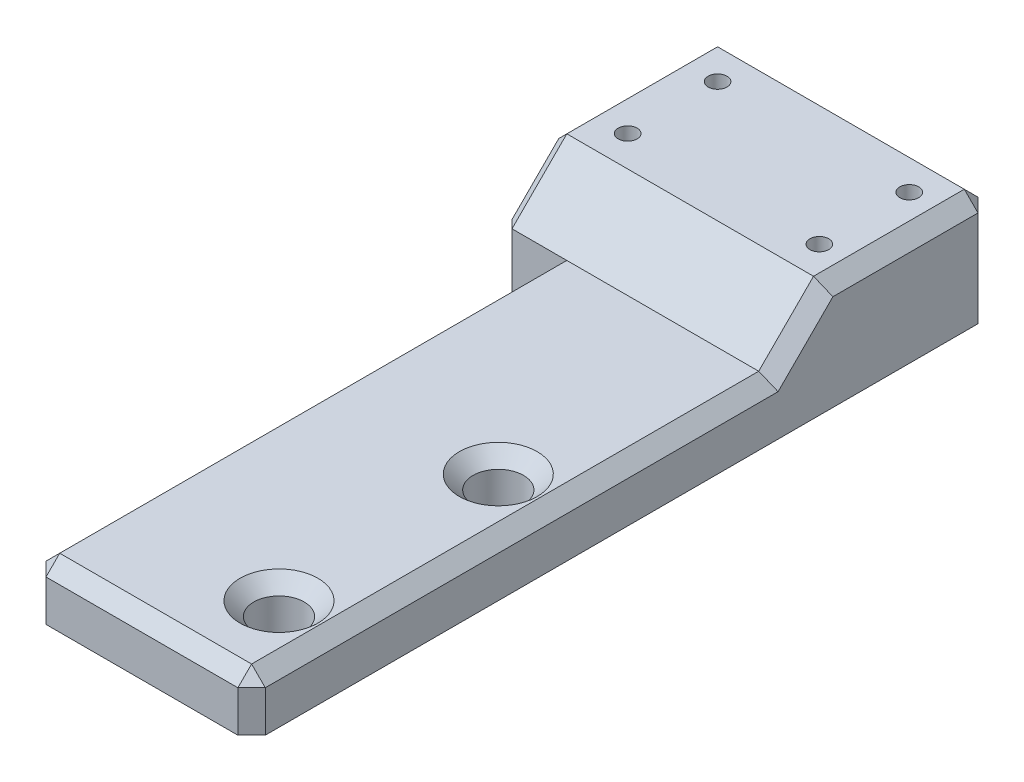
ISO-10303-21;
HEADER;
FILE_DESCRIPTION(('STEP AP214'),'2;1');
FILE_NAME('part.step','',(''),(''),'','','');
FILE_SCHEMA(('AUTOMOTIVE_DESIGN { 1 0 10303 214 1 1 1 1 }'));
ENDSEC;
DATA;
#1=APPLICATION_CONTEXT('core data for automotive mechanical design processes');
#2=APPLICATION_PROTOCOL_DEFINITION('international standard','automotive_design',2000,#1);
#3=PRODUCT_CONTEXT('',#1,'mechanical');
#4=PRODUCT('Part','Part','',(#3));
#5=PRODUCT_RELATED_PRODUCT_CATEGORY('part','',(#4));
#6=PRODUCT_DEFINITION_FORMATION('','',#4);
#7=PRODUCT_DEFINITION_CONTEXT('part definition',#1,'design');
#8=PRODUCT_DEFINITION('design','',#6,#7);
#9=PRODUCT_DEFINITION_SHAPE('','',#8);
#10=(LENGTH_UNIT() NAMED_UNIT(*) SI_UNIT(.MILLI.,.METRE.));
#11=(NAMED_UNIT(*) PLANE_ANGLE_UNIT() SI_UNIT($,.RADIAN.));
#12=(NAMED_UNIT(*) SI_UNIT($,.STERADIAN.) SOLID_ANGLE_UNIT());
#13=UNCERTAINTY_MEASURE_WITH_UNIT(LENGTH_MEASURE(1.E-05),#10,'distance_accuracy_value','');
#14=(GEOMETRIC_REPRESENTATION_CONTEXT(3) GLOBAL_UNCERTAINTY_ASSIGNED_CONTEXT((#13)) GLOBAL_UNIT_ASSIGNED_CONTEXT((#10,
#11,#12)) REPRESENTATION_CONTEXT('',''));
#15=CARTESIAN_POINT('',(0.,0.,0.));
#16=DIRECTION('',(0.,0.,1.));
#17=DIRECTION('',(1.,0.,0.));
#18=AXIS2_PLACEMENT_3D('',#15,#16,#17);
#19=CARTESIAN_POINT('',(0.,12.7,0.));
#20=DIRECTION('',(0.,-1.,0.));
#21=DIRECTION('',(0.,0.,-1.));
#22=AXIS2_PLACEMENT_3D('',#19,#20,#21);
#23=PLANE('',#22);
#24=CARTESIAN_POINT('',(5.08,12.7,-80.645));
#25=DIRECTION('',(0.,-1.,0.));
#26=DIRECTION('',(0.,0.,-1.));
#27=AXIS2_PLACEMENT_3D('',#24,#25,#26);
#28=CIRCLE('',#27,1.09219999999999);
#29=CARTESIAN_POINT('',(5.08,12.7,-81.7372));
#30=VERTEX_POINT('',#29);
#31=EDGE_CURVE('E203',#30,#30,#28,.T.);
#32=ORIENTED_EDGE('',*,*,#31,.T.);
#33=EDGE_LOOP('',(#32));
#34=FACE_BOUND('',#33,.T.);
#35=CARTESIAN_POINT('',(27.2796,12.7,-80.645));
#36=DIRECTION('',(0.,-1.,0.));
#37=DIRECTION('',(0.,0.,-1.));
#38=AXIS2_PLACEMENT_3D('',#35,#36,#37);
#39=CIRCLE('',#38,1.0922);
#40=CARTESIAN_POINT('',(27.2796,12.7,-81.7372));
#41=VERTEX_POINT('',#40);
#42=EDGE_CURVE('E182',#41,#41,#39,.T.);
#43=ORIENTED_EDGE('',*,*,#42,.T.);
#44=EDGE_LOOP('',(#43));
#45=FACE_BOUND('',#44,.T.);
#46=CARTESIAN_POINT('',(5.08,12.7,-70.231));
#47=DIRECTION('',(0.,-1.,0.));
#48=DIRECTION('',(0.,0.,-1.));
#49=AXIS2_PLACEMENT_3D('',#46,#47,#48);
#50=CIRCLE('',#49,1.09219999999999);
#51=CARTESIAN_POINT('',(5.08,12.7,-71.3232));
#52=VERTEX_POINT('',#51);
#53=EDGE_CURVE('E409',#52,#52,#50,.T.);
#54=ORIENTED_EDGE('',*,*,#53,.T.);
#55=EDGE_LOOP('',(#54));
#56=FACE_BOUND('',#55,.T.);
#57=CARTESIAN_POINT('',(27.2796,12.7,-70.231));
#58=DIRECTION('',(0.,-1.,0.));
#59=DIRECTION('',(0.,0.,-1.));
#60=AXIS2_PLACEMENT_3D('',#57,#58,#59);
#61=CIRCLE('',#60,1.0922);
#62=CARTESIAN_POINT('',(27.2796,12.7,-71.3232));
#63=VERTEX_POINT('',#62);
#64=EDGE_CURVE('E194',#63,#63,#61,.T.);
#65=ORIENTED_EDGE('',*,*,#64,.T.);
#66=EDGE_LOOP('',(#65));
#67=FACE_BOUND('',#66,.T.);
#68=DIRECTION('',(1.,0.,0.));
#69=VECTOR('',#68,1.);
#70=CARTESIAN_POINT('',(0.,12.7,-66.675));
#71=LINE('',#70,#69);
#72=CARTESIAN_POINT('',(1.58750000000002,12.7,-66.675));
#73=VERTEX_POINT('',#72);
#74=CARTESIAN_POINT('',(30.1625,12.7,-66.675));
#75=VERTEX_POINT('',#74);
#76=EDGE_CURVE('E230',#73,#75,#71,.T.);
#77=ORIENTED_EDGE('',*,*,#76,.T.);
#78=DIRECTION('',(0.,0.,-1.));
#79=VECTOR('',#78,1.);
#80=CARTESIAN_POINT('',(30.1625,12.7,0.));
#81=LINE('',#80,#79);
#82=CARTESIAN_POINT('',(30.1625,12.7,-84.1375));
#83=VERTEX_POINT('',#82);
#84=EDGE_CURVE('E326',#75,#83,#81,.T.);
#85=ORIENTED_EDGE('',*,*,#84,.T.);
#86=DIRECTION('',(-1.,0.,0.));
#87=VECTOR('',#86,1.);
#88=CARTESIAN_POINT('',(0.,12.7,-84.1375));
#89=LINE('',#88,#87);
#90=CARTESIAN_POINT('',(1.58750000000002,12.7,-84.1375));
#91=VERTEX_POINT('',#90);
#92=EDGE_CURVE('E323',#83,#91,#89,.T.);
#93=ORIENTED_EDGE('',*,*,#92,.T.);
#94=DIRECTION('',(0.,0.,1.));
#95=VECTOR('',#94,1.);
#96=CARTESIAN_POINT('',(1.58750000000002,12.7,0.));
#97=LINE('',#96,#95);
#98=EDGE_CURVE('E320',#91,#73,#97,.T.);
#99=ORIENTED_EDGE('',*,*,#98,.T.);
#100=EDGE_LOOP('',(#77,#85,#93,#99));
#101=FACE_BOUND('',#100,.T.);
#102=ADVANCED_FACE('F41',(#34,#45,#56,#67,#101),#23,.F.);
#103=CARTESIAN_POINT('',(0.,0.,0.));
#104=DIRECTION('',(0.,-1.,0.));
#105=DIRECTION('',(0.,0.,-1.));
#106=AXIS2_PLACEMENT_3D('',#103,#104,#105);
#107=PLANE('',#106);
#108=CARTESIAN_POINT('',(5.08,0.,-80.645));
#109=DIRECTION('',(0.,-1.,0.));
#110=DIRECTION('',(0.,0.,-1.));
#111=AXIS2_PLACEMENT_3D('',#108,#109,#110);
#112=CIRCLE('',#111,1.09219999999999);
#113=CARTESIAN_POINT('',(5.08,0.,-81.7372));
#114=VERTEX_POINT('',#113);
#115=EDGE_CURVE('E173',#114,#114,#112,.T.);
#116=ORIENTED_EDGE('',*,*,#115,.F.);
#117=EDGE_LOOP('',(#116));
#118=FACE_BOUND('',#117,.T.);
#119=DIRECTION('',(-1.,0.,0.));
#120=VECTOR('',#119,1.);
#121=CARTESIAN_POINT('',(0.,0.,-85.725));
#122=LINE('',#121,#120);
#123=CARTESIAN_POINT('',(30.1625,0.,-85.725));
#124=VERTEX_POINT('',#123);
#125=CARTESIAN_POINT('',(1.58750000000002,0.,-85.725));
#126=VERTEX_POINT('',#125);
#127=EDGE_CURVE('E226',#124,#126,#122,.T.);
#128=ORIENTED_EDGE('',*,*,#127,.F.);
#129=DIRECTION('',(-0.707106781186544,0.,-0.707106781186551));
#130=VECTOR('',#129,1.);
#131=CARTESIAN_POINT('',(57.9437500000001,0.,-57.9437499999996));
#132=LINE('',#131,#130);
#133=CARTESIAN_POINT('',(31.75,0.,-84.1375));
#134=VERTEX_POINT('',#133);
#135=EDGE_CURVE('E282',#124,#134,#132,.F.);
#136=ORIENTED_EDGE('',*,*,#135,.T.);
#137=DIRECTION('',(0.,0.,-1.));
#138=VECTOR('',#137,1.);
#139=CARTESIAN_POINT('',(31.75,0.,0.));
#140=LINE('',#139,#138);
#141=CARTESIAN_POINT('',(31.75,0.,-1.58750000000001));
#142=VERTEX_POINT('',#141);
#143=EDGE_CURVE('E222',#142,#134,#140,.T.);
#144=ORIENTED_EDGE('',*,*,#143,.F.);
#145=DIRECTION('',(0.707106781186551,0.,-0.707106781186544));
#146=VECTOR('',#145,1.);
#147=CARTESIAN_POINT('',(15.0812499999999,0.,15.08125));
#148=LINE('',#147,#146);
#149=CARTESIAN_POINT('',(30.1625,0.,0.));
#150=VERTEX_POINT('',#149);
#151=EDGE_CURVE('E279',#142,#150,#148,.F.);
#152=ORIENTED_EDGE('',*,*,#151,.T.);
#153=DIRECTION('',(1.,0.,0.));
#154=VECTOR('',#153,1.);
#155=CARTESIAN_POINT('',(0.,0.,0.));
#156=LINE('',#155,#154);
#157=CARTESIAN_POINT('',(7.93750000000001,0.,0.));
#158=VERTEX_POINT('',#157);
#159=EDGE_CURVE('E218',#158,#150,#156,.T.);
#160=ORIENTED_EDGE('',*,*,#159,.F.);
#161=DIRECTION('',(0.707106781186544,0.,0.707106781186551));
#162=VECTOR('',#161,1.);
#163=CARTESIAN_POINT('',(3.96875000000004,0.,-3.96875));
#164=LINE('',#163,#162);
#165=CARTESIAN_POINT('',(6.35,0.,-1.58750000000002));
#166=VERTEX_POINT('',#165);
#167=EDGE_CURVE('E189',#158,#166,#164,.F.);
#168=ORIENTED_EDGE('',*,*,#167,.T.);
#169=DIRECTION('',(0.,0.,1.));
#170=VECTOR('',#169,1.);
#171=CARTESIAN_POINT('',(6.35,0.,0.));
#172=LINE('',#171,#170);
#173=CARTESIAN_POINT('',(6.35000000000001,0.,-60.325));
#174=VERTEX_POINT('',#173);
#175=EDGE_CURVE('E166',#174,#166,#172,.T.);
#176=ORIENTED_EDGE('',*,*,#175,.F.);
#177=DIRECTION('',(1.,0.,0.));
#178=VECTOR('',#177,1.);
#179=CARTESIAN_POINT('',(0.,0.,-60.325));
#180=LINE('',#179,#178);
#181=CARTESIAN_POINT('',(1.58750000000002,0.,-60.325));
#182=VERTEX_POINT('',#181);
#183=EDGE_CURVE('E176',#182,#174,#180,.T.);
#184=ORIENTED_EDGE('',*,*,#183,.F.);
#185=DIRECTION('',(0.707106781186551,0.,0.707106781186544));
#186=VECTOR('',#185,1.);
#187=CARTESIAN_POINT('',(30.95625,0.,-30.9562500000003));
#188=LINE('',#187,#186);
#189=CARTESIAN_POINT('',(0.,0.,-61.9125));
#190=VERTEX_POINT('',#189);
#191=EDGE_CURVE('E271',#182,#190,#188,.F.);
#192=ORIENTED_EDGE('',*,*,#191,.T.);
#193=DIRECTION('',(0.,0.,1.));
#194=VECTOR('',#193,1.);
#195=CARTESIAN_POINT('',(0.,0.,0.));
#196=LINE('',#195,#194);
#197=CARTESIAN_POINT('',(0.,0.,-84.1375));
#198=VERTEX_POINT('',#197);
#199=EDGE_CURVE('E214',#198,#190,#196,.T.);
#200=ORIENTED_EDGE('',*,*,#199,.F.);
#201=DIRECTION('',(-0.707106781186551,0.,0.707106781186544));
#202=VECTOR('',#201,1.);
#203=CARTESIAN_POINT('',(-42.06875,0.,-42.0687500000004));
#204=LINE('',#203,#202);
#205=EDGE_CURVE('E274',#198,#126,#204,.F.);
#206=ORIENTED_EDGE('',*,*,#205,.T.);
#207=EDGE_LOOP('',(#128,#136,#144,#152,#160,#168,#176,#184,#192,#200,#206));
#208=FACE_BOUND('',#207,.T.);
#209=CARTESIAN_POINT('',(27.2796,0.,-80.645));
#210=DIRECTION('',(0.,-1.,0.));
#211=DIRECTION('',(0.,0.,-1.));
#212=AXIS2_PLACEMENT_3D('',#209,#210,#211);
#213=CIRCLE('',#212,1.0922);
#214=CARTESIAN_POINT('',(27.2796,0.,-81.7372));
#215=VERTEX_POINT('',#214);
#216=EDGE_CURVE('E415',#215,#215,#213,.T.);
#217=ORIENTED_EDGE('',*,*,#216,.F.);
#218=EDGE_LOOP('',(#217));
#219=FACE_BOUND('',#218,.T.);
#220=CARTESIAN_POINT('',(5.08,0.,-70.231));
#221=DIRECTION('',(0.,-1.,0.));
#222=DIRECTION('',(0.,0.,-1.));
#223=AXIS2_PLACEMENT_3D('',#220,#221,#222);
#224=CIRCLE('',#223,1.09219999999999);
#225=CARTESIAN_POINT('',(5.08,0.,-71.3232));
#226=VERTEX_POINT('',#225);
#227=EDGE_CURVE('E405',#226,#226,#224,.T.);
#228=ORIENTED_EDGE('',*,*,#227,.F.);
#229=EDGE_LOOP('',(#228));
#230=FACE_BOUND('',#229,.T.);
#231=CARTESIAN_POINT('',(27.2796,0.,-70.231));
#232=DIRECTION('',(0.,-1.,0.));
#233=DIRECTION('',(0.,0.,-1.));
#234=AXIS2_PLACEMENT_3D('',#231,#232,#233);
#235=CIRCLE('',#234,1.0922);
#236=CARTESIAN_POINT('',(27.2796,0.,-71.3232));
#237=VERTEX_POINT('',#236);
#238=EDGE_CURVE('E199',#237,#237,#235,.T.);
#239=ORIENTED_EDGE('',*,*,#238,.F.);
#240=EDGE_LOOP('',(#239));
#241=FACE_BOUND('',#240,.T.);
#242=CARTESIAN_POINT('',(25.4,0.,-9.525));
#243=DIRECTION('',(0.,1.,0.));
#244=DIRECTION('',(0.,0.,1.));
#245=AXIS2_PLACEMENT_3D('',#242,#243,#244);
#246=CIRCLE('',#245,2.921);
#247=CARTESIAN_POINT('',(25.4,0.,-6.604));
#248=VERTEX_POINT('',#247);
#249=EDGE_CURVE('E210',#248,#248,#246,.T.);
#250=ORIENTED_EDGE('',*,*,#249,.T.);
#251=EDGE_LOOP('',(#250));
#252=FACE_BOUND('',#251,.T.);
#253=CARTESIAN_POINT('',(25.4,0.,-34.925));
#254=DIRECTION('',(0.,1.,0.));
#255=DIRECTION('',(0.,0.,1.));
#256=AXIS2_PLACEMENT_3D('',#253,#254,#255);
#257=CIRCLE('',#256,2.921);
#258=CARTESIAN_POINT('',(25.4,0.,-32.004));
#259=VERTEX_POINT('',#258);
#260=EDGE_CURVE('E206',#259,#259,#257,.T.);
#261=ORIENTED_EDGE('',*,*,#260,.T.);
#262=EDGE_LOOP('',(#261));
#263=FACE_BOUND('',#262,.T.);
#264=ADVANCED_FACE('F185',(#118,#208,#219,#230,#241,#252,#263),#107,.T.);
#265=CARTESIAN_POINT('',(0.,12.7,0.));
#266=DIRECTION('',(1.,0.,0.));
#267=DIRECTION('',(0.,0.,-1.));
#268=AXIS2_PLACEMENT_3D('',#265,#266,#267);
#269=PLANE('',#268);
#270=DIRECTION('',(0.,0.,-1.));
#271=VECTOR('',#270,1.);
#272=CARTESIAN_POINT('',(0.,11.1125,0.));
#273=LINE('',#272,#271);
#274=CARTESIAN_POINT('',(0.,11.1125,-67.3325640302673));
#275=VERTEX_POINT('',#274);
#276=CARTESIAN_POINT('',(0.,11.1125,-84.1375));
#277=VERTEX_POINT('',#276);
#278=EDGE_CURVE('E68',#275,#277,#273,.T.);
#279=ORIENTED_EDGE('',*,*,#278,.T.);
#280=DIRECTION('',(0.,-1.,0.));
#281=VECTOR('',#280,1.);
#282=CARTESIAN_POINT('',(0.,12.7,-84.1375));
#283=LINE('',#282,#281);
#284=EDGE_CURVE('E337',#277,#198,#283,.T.);
#285=ORIENTED_EDGE('',*,*,#284,.T.);
#286=ORIENTED_EDGE('',*,*,#199,.T.);
#287=DIRECTION('',(0.,1.,0.));
#288=VECTOR('',#287,1.);
#289=CARTESIAN_POINT('',(0.,12.7,-61.9125));
#290=LINE('',#289,#288);
#291=CARTESIAN_POINT('',(0.,5.69243596973268,-61.9125));
#292=VERTEX_POINT('',#291);
#293=EDGE_CURVE('E329',#190,#292,#290,.T.);
#294=ORIENTED_EDGE('',*,*,#293,.T.);
#295=DIRECTION('',(0.,0.707106781186548,-0.707106781186547));
#296=VECTOR('',#295,1.);
#297=CARTESIAN_POINT('',(0.,11.5774679848664,-67.7975320151337));
#298=LINE('',#297,#296);
#299=EDGE_CURVE('E332',#292,#275,#298,.T.);
#300=ORIENTED_EDGE('',*,*,#299,.T.);
#301=EDGE_LOOP('',(#279,#285,#286,#294,#300));
#302=FACE_BOUND('',#301,.T.);
#303=ADVANCED_FACE('F428',(#302),#269,.F.);
#304=CARTESIAN_POINT('',(0.,12.7,0.));
#305=DIRECTION('',(0.,0.,-1.));
#306=DIRECTION('',(-1.,0.,0.));
#307=AXIS2_PLACEMENT_3D('',#304,#305,#306);
#308=PLANE('',#307);
#309=ORIENTED_EDGE('',*,*,#159,.T.);
#310=DIRECTION('',(0.,1.,0.));
#311=VECTOR('',#310,1.);
#312=CARTESIAN_POINT('',(30.1625,12.7,0.));
#313=LINE('',#312,#311);
#314=CARTESIAN_POINT('',(30.1625,4.76249999999998,0.));
#315=VERTEX_POINT('',#314);
#316=EDGE_CURVE('E306',#150,#315,#313,.T.);
#317=ORIENTED_EDGE('',*,*,#316,.T.);
#318=DIRECTION('',(-1.,0.,0.));
#319=VECTOR('',#318,1.);
#320=CARTESIAN_POINT('',(0.,4.76249999999998,0.));
#321=LINE('',#320,#319);
#322=CARTESIAN_POINT('',(7.93750000000001,4.76249999999998,0.));
#323=VERTEX_POINT('',#322);
#324=EDGE_CURVE('E300',#315,#323,#321,.T.);
#325=ORIENTED_EDGE('',*,*,#324,.T.);
#326=DIRECTION('',(0.,-1.,0.));
#327=VECTOR('',#326,1.);
#328=CARTESIAN_POINT('',(7.93750000000001,12.7,0.));
#329=LINE('',#328,#327);
#330=EDGE_CURVE('E303',#323,#158,#329,.T.);
#331=ORIENTED_EDGE('',*,*,#330,.T.);
#332=EDGE_LOOP('',(#309,#317,#325,#331));
#333=FACE_BOUND('',#332,.T.);
#334=ADVANCED_FACE('F434',(#333),#308,.F.);
#335=CARTESIAN_POINT('',(31.75,12.7,0.));
#336=DIRECTION('',(-1.,0.,0.));
#337=DIRECTION('',(0.,0.,1.));
#338=AXIS2_PLACEMENT_3D('',#335,#336,#337);
#339=PLANE('',#338);
#340=ORIENTED_EDGE('',*,*,#143,.T.);
#341=DIRECTION('',(0.,1.,0.));
#342=VECTOR('',#341,1.);
#343=CARTESIAN_POINT('',(31.75,12.7,-84.1375));
#344=LINE('',#343,#342);
#345=CARTESIAN_POINT('',(31.75,11.1125,-84.1375));
#346=VERTEX_POINT('',#345);
#347=EDGE_CURVE('E297',#134,#346,#344,.T.);
#348=ORIENTED_EDGE('',*,*,#347,.T.);
#349=DIRECTION('',(0.,0.,1.));
#350=VECTOR('',#349,1.);
#351=CARTESIAN_POINT('',(31.75,11.1125,0.));
#352=LINE('',#351,#350);
#353=CARTESIAN_POINT('',(31.75,11.1125,-67.3325640302673));
#354=VERTEX_POINT('',#353);
#355=EDGE_CURVE('E285',#346,#354,#352,.T.);
#356=ORIENTED_EDGE('',*,*,#355,.T.);
#357=DIRECTION('',(0.,-0.707106781186548,0.707106781186547));
#358=VECTOR('',#357,1.);
#359=CARTESIAN_POINT('',(31.75,5.22746798486634,-61.4475320151337));
#360=LINE('',#359,#358);
#361=CARTESIAN_POINT('',(31.75,4.76249999999998,-60.9825640302673));
#362=VERTEX_POINT('',#361);
#363=EDGE_CURVE('E288',#354,#362,#360,.T.);
#364=ORIENTED_EDGE('',*,*,#363,.T.);
#365=DIRECTION('',(0.,0.,1.));
#366=VECTOR('',#365,1.);
#367=CARTESIAN_POINT('',(31.75,4.76249999999998,0.));
#368=LINE('',#367,#366);
#369=CARTESIAN_POINT('',(31.75,4.76249999999998,-1.58750000000001));
#370=VERTEX_POINT('',#369);
#371=EDGE_CURVE('E291',#362,#370,#368,.T.);
#372=ORIENTED_EDGE('',*,*,#371,.T.);
#373=DIRECTION('',(0.,-1.,0.));
#374=VECTOR('',#373,1.);
#375=CARTESIAN_POINT('',(31.75,12.7,-1.58750000000001));
#376=LINE('',#375,#374);
#377=EDGE_CURVE('E294',#370,#142,#376,.T.);
#378=ORIENTED_EDGE('',*,*,#377,.T.);
#379=EDGE_LOOP('',(#340,#348,#356,#364,#372,#378));
#380=FACE_BOUND('',#379,.T.);
#381=ADVANCED_FACE('F444',(#380),#339,.F.);
#382=CARTESIAN_POINT('',(0.,12.7,-85.725));
#383=DIRECTION('',(0.,0.,1.));
#384=DIRECTION('',(1.,0.,0.));
#385=AXIS2_PLACEMENT_3D('',#382,#383,#384);
#386=PLANE('',#385);
#387=DIRECTION('',(1.,0.,0.));
#388=VECTOR('',#387,1.);
#389=CARTESIAN_POINT('',(0.,11.1125,-85.725));
#390=LINE('',#389,#388);
#391=CARTESIAN_POINT('',(1.58750000000002,11.1125,-85.725));
#392=VERTEX_POINT('',#391);
#393=CARTESIAN_POINT('',(30.1625,11.1125,-85.725));
#394=VERTEX_POINT('',#393);
#395=EDGE_CURVE('E261',#392,#394,#390,.T.);
#396=ORIENTED_EDGE('',*,*,#395,.T.);
#397=DIRECTION('',(0.,-1.,0.));
#398=VECTOR('',#397,1.);
#399=CARTESIAN_POINT('',(30.1625,12.7,-85.725));
#400=LINE('',#399,#398);
#401=EDGE_CURVE('E267',#394,#124,#400,.T.);
#402=ORIENTED_EDGE('',*,*,#401,.T.);
#403=ORIENTED_EDGE('',*,*,#127,.T.);
#404=DIRECTION('',(0.,1.,0.));
#405=VECTOR('',#404,1.);
#406=CARTESIAN_POINT('',(1.58750000000002,12.7,-85.725));
#407=LINE('',#406,#405);
#408=EDGE_CURVE('E264',#126,#392,#407,.T.);
#409=ORIENTED_EDGE('',*,*,#408,.T.);
#410=EDGE_LOOP('',(#396,#402,#403,#409));
#411=FACE_BOUND('',#410,.T.);
#412=ADVANCED_FACE('F440',(#411),#386,.F.);
#413=CARTESIAN_POINT('',(25.4,12.7,-9.525));
#414=DIRECTION('',(0.,-1.,0.));
#415=DIRECTION('',(0.,0.,-1.));
#416=AXIS2_PLACEMENT_3D('',#413,#414,#415);
#417=CYLINDRICAL_SURFACE('',#416,2.921);
#418=CARTESIAN_POINT('',(25.4,4.76250000000001,-9.525));
#419=DIRECTION('',(0.,-1.,0.));
#420=DIRECTION('',(0.,0.,-1.));
#421=AXIS2_PLACEMENT_3D('',#418,#419,#420);
#422=CIRCLE('',#421,2.921);
#423=CARTESIAN_POINT('',(25.4,4.76250000000001,-12.446));
#424=VERTEX_POINT('',#423);
#425=EDGE_CURVE('E253',#424,#424,#422,.F.);
#426=ORIENTED_EDGE('',*,*,#425,.T.);
#427=EDGE_LOOP('',(#426));
#428=FACE_BOUND('',#427,.T.);
#429=ORIENTED_EDGE('',*,*,#249,.F.);
#430=EDGE_LOOP('',(#429));
#431=FACE_BOUND('',#430,.T.);
#432=ADVANCED_FACE('F443',(#428,#431),#417,.F.);
#433=CARTESIAN_POINT('',(25.4,12.7,-34.925));
#434=DIRECTION('',(0.,-1.,0.));
#435=DIRECTION('',(0.,0.,-1.));
#436=AXIS2_PLACEMENT_3D('',#433,#434,#435);
#437=CYLINDRICAL_SURFACE('',#436,2.921);
#438=CARTESIAN_POINT('',(25.4,4.76250000000001,-34.925));
#439=DIRECTION('',(0.,-1.,0.));
#440=DIRECTION('',(0.,0.,-1.));
#441=AXIS2_PLACEMENT_3D('',#438,#439,#440);
#442=CIRCLE('',#441,2.921);
#443=CARTESIAN_POINT('',(25.4,4.76250000000001,-37.846));
#444=VERTEX_POINT('',#443);
#445=EDGE_CURVE('E257',#444,#444,#442,.F.);
#446=ORIENTED_EDGE('',*,*,#445,.T.);
#447=EDGE_LOOP('',(#446));
#448=FACE_BOUND('',#447,.T.);
#449=ORIENTED_EDGE('',*,*,#260,.F.);
#450=EDGE_LOOP('',(#449));
#451=FACE_BOUND('',#450,.T.);
#452=ADVANCED_FACE('F636',(#448,#451),#437,.F.);
#453=CARTESIAN_POINT('',(0.,12.7,-60.325));
#454=DIRECTION('',(0.,0.,-1.));
#455=DIRECTION('',(-1.,0.,0.));
#456=AXIS2_PLACEMENT_3D('',#453,#454,#455);
#457=PLANE('',#456);
#458=DIRECTION('',(-1.,0.,0.));
#459=VECTOR('',#458,1.);
#460=CARTESIAN_POINT('',(0.,6.34999999999998,-60.325));
#461=LINE('',#460,#459);
#462=CARTESIAN_POINT('',(7.93750000000001,6.35,-60.325));
#463=VERTEX_POINT('',#462);
#464=CARTESIAN_POINT('',(1.58750000000002,6.34999999999998,-60.325));
#465=VERTEX_POINT('',#464);
#466=EDGE_CURVE('E60',#463,#465,#461,.T.);
#467=ORIENTED_EDGE('',*,*,#466,.T.);
#468=DIRECTION('',(0.,-1.,0.));
#469=VECTOR('',#468,1.);
#470=CARTESIAN_POINT('',(1.58750000000002,12.7,-60.325));
#471=LINE('',#470,#469);
#472=EDGE_CURVE('E52',#465,#182,#471,.T.);
#473=ORIENTED_EDGE('',*,*,#472,.T.);
#474=ORIENTED_EDGE('',*,*,#183,.T.);
#475=DIRECTION('',(0.,-1.,0.));
#476=VECTOR('',#475,1.);
#477=CARTESIAN_POINT('',(6.35000000000001,12.7,-60.325));
#478=LINE('',#477,#476);
#479=CARTESIAN_POINT('',(6.35000000000001,4.76249999999998,-60.325));
#480=VERTEX_POINT('',#479);
#481=EDGE_CURVE('E162',#480,#174,#478,.T.);
#482=ORIENTED_EDGE('',*,*,#481,.F.);
#483=DIRECTION('',(-0.707106781186544,-0.707106781186551,0.));
#484=VECTOR('',#483,1.);
#485=CARTESIAN_POINT('',(7.14375000000004,5.55625000000002,-60.325));
#486=LINE('',#485,#484);
#487=EDGE_CURVE('E11',#480,#463,#486,.F.);
#488=ORIENTED_EDGE('',*,*,#487,.T.);
#489=EDGE_LOOP('',(#467,#473,#474,#482,#488));
#490=FACE_BOUND('',#489,.T.);
#491=ADVANCED_FACE('F177',(#490),#457,.F.);
#492=CARTESIAN_POINT('',(0.,6.35,0.));
#493=DIRECTION('',(0.,-1.,0.));
#494=DIRECTION('',(0.,0.,-1.));
#495=AXIS2_PLACEMENT_3D('',#492,#493,#494);
#496=PLANE('',#495);
#497=CARTESIAN_POINT('',(25.4,6.35,-9.525));
#498=DIRECTION('',(0.,-1.,0.));
#499=DIRECTION('',(0.,0.,-1.));
#500=AXIS2_PLACEMENT_3D('',#497,#498,#499);
#501=CIRCLE('',#500,4.50849999999998);
#502=CARTESIAN_POINT('',(25.4,6.35,-14.0335));
#503=VERTEX_POINT('',#502);
#504=EDGE_CURVE('E249',#503,#503,#501,.T.);
#505=ORIENTED_EDGE('',*,*,#504,.T.);
#506=EDGE_LOOP('',(#505));
#507=FACE_BOUND('',#506,.T.);
#508=CARTESIAN_POINT('',(25.4,6.35,-34.925));
#509=DIRECTION('',(0.,-1.,0.));
#510=DIRECTION('',(0.,0.,-1.));
#511=AXIS2_PLACEMENT_3D('',#508,#509,#510);
#512=CIRCLE('',#511,4.50849999999999);
#513=CARTESIAN_POINT('',(25.4,6.35,-39.4335));
#514=VERTEX_POINT('',#513);
#515=EDGE_CURVE('E245',#514,#514,#512,.T.);
#516=ORIENTED_EDGE('',*,*,#515,.T.);
#517=EDGE_LOOP('',(#516));
#518=FACE_BOUND('',#517,.T.);
#519=DIRECTION('',(1.,0.,0.));
#520=VECTOR('',#519,1.);
#521=CARTESIAN_POINT('',(0.,6.35,-60.325));
#522=LINE('',#521,#520);
#523=CARTESIAN_POINT('',(30.1625,6.35,-60.325));
#524=VERTEX_POINT('',#523);
#525=EDGE_CURVE('E198',#463,#524,#522,.T.);
#526=ORIENTED_EDGE('',*,*,#525,.F.);
#527=DIRECTION('',(0.,0.,1.));
#528=VECTOR('',#527,1.);
#529=CARTESIAN_POINT('',(7.93750000000001,6.35,0.));
#530=LINE('',#529,#528);
#531=CARTESIAN_POINT('',(7.93750000000001,6.35,-1.58750000000001));
#532=VERTEX_POINT('',#531);
#533=EDGE_CURVE('E242',#463,#532,#530,.T.);
#534=ORIENTED_EDGE('',*,*,#533,.T.);
#535=DIRECTION('',(1.,0.,0.));
#536=VECTOR('',#535,1.);
#537=CARTESIAN_POINT('',(0.,6.35,-1.58750000000001));
#538=LINE('',#537,#536);
#539=CARTESIAN_POINT('',(30.1625,6.35,-1.58750000000001));
#540=VERTEX_POINT('',#539);
#541=EDGE_CURVE('E239',#532,#540,#538,.T.);
#542=ORIENTED_EDGE('',*,*,#541,.T.);
#543=DIRECTION('',(0.,0.,-1.));
#544=VECTOR('',#543,1.);
#545=CARTESIAN_POINT('',(30.1625,6.35,0.));
#546=LINE('',#545,#544);
#547=EDGE_CURVE('E236',#540,#524,#546,.T.);
#548=ORIENTED_EDGE('',*,*,#547,.T.);
#549=EDGE_LOOP('',(#526,#534,#542,#548));
#550=FACE_BOUND('',#549,.T.);
#551=ADVANCED_FACE('F622',(#507,#518,#550),#496,.F.);
#552=CARTESIAN_POINT('',(6.35,12.7,0.));
#553=DIRECTION('',(1.,0.,0.));
#554=DIRECTION('',(0.,0.,-1.));
#555=AXIS2_PLACEMENT_3D('',#552,#553,#554);
#556=PLANE('',#555);
#557=ORIENTED_EDGE('',*,*,#175,.T.);
#558=DIRECTION('',(0.,1.,0.));
#559=VECTOR('',#558,1.);
#560=CARTESIAN_POINT('',(6.35,12.7,-1.58750000000002));
#561=LINE('',#560,#559);
#562=CARTESIAN_POINT('',(6.35,4.76249999999998,-1.58750000000002));
#563=VERTEX_POINT('',#562);
#564=EDGE_CURVE('E311',#166,#563,#561,.T.);
#565=ORIENTED_EDGE('',*,*,#564,.T.);
#566=DIRECTION('',(0.,0.,-1.));
#567=VECTOR('',#566,1.);
#568=CARTESIAN_POINT('',(6.35,4.76249999999998,0.));
#569=LINE('',#568,#567);
#570=EDGE_CURVE('E169',#563,#480,#569,.T.);
#571=ORIENTED_EDGE('',*,*,#570,.T.);
#572=ORIENTED_EDGE('',*,*,#481,.T.);
#573=EDGE_LOOP('',(#557,#565,#571,#572));
#574=FACE_BOUND('',#573,.T.);
#575=ADVANCED_FACE('F164',(#574),#556,.F.);
#576=CARTESIAN_POINT('',(27.2796,12.7,-70.231));
#577=DIRECTION('',(0.,-1.,0.));
#578=DIRECTION('',(0.,0.,-1.));
#579=AXIS2_PLACEMENT_3D('',#576,#577,#578);
#580=CYLINDRICAL_SURFACE('',#579,1.0922);
#581=ORIENTED_EDGE('',*,*,#64,.F.);
#582=EDGE_LOOP('',(#581));
#583=FACE_BOUND('',#582,.T.);
#584=ORIENTED_EDGE('',*,*,#238,.T.);
#585=EDGE_LOOP('',(#584));
#586=FACE_BOUND('',#585,.T.);
#587=ADVANCED_FACE('F634',(#583,#586),#580,.F.);
#588=CARTESIAN_POINT('',(5.08,12.7,-70.231));
#589=DIRECTION('',(0.,-1.,0.));
#590=DIRECTION('',(0.,0.,-1.));
#591=AXIS2_PLACEMENT_3D('',#588,#589,#590);
#592=CYLINDRICAL_SURFACE('',#591,1.09219999999999);
#593=ORIENTED_EDGE('',*,*,#53,.F.);
#594=EDGE_LOOP('',(#593));
#595=FACE_BOUND('',#594,.T.);
#596=ORIENTED_EDGE('',*,*,#227,.T.);
#597=EDGE_LOOP('',(#596));
#598=FACE_BOUND('',#597,.T.);
#599=ADVANCED_FACE('F814',(#595,#598),#592,.F.);
#600=CARTESIAN_POINT('',(27.2796,12.7,-80.645));
#601=DIRECTION('',(0.,-1.,0.));
#602=DIRECTION('',(0.,0.,-1.));
#603=AXIS2_PLACEMENT_3D('',#600,#601,#602);
#604=CYLINDRICAL_SURFACE('',#603,1.0922);
#605=ORIENTED_EDGE('',*,*,#42,.F.);
#606=EDGE_LOOP('',(#605));
#607=FACE_BOUND('',#606,.T.);
#608=ORIENTED_EDGE('',*,*,#216,.T.);
#609=EDGE_LOOP('',(#608));
#610=FACE_BOUND('',#609,.T.);
#611=ADVANCED_FACE('F806',(#607,#610),#604,.F.);
#612=CARTESIAN_POINT('',(5.08,12.7,-80.645));
#613=DIRECTION('',(0.,-1.,0.));
#614=DIRECTION('',(0.,0.,-1.));
#615=AXIS2_PLACEMENT_3D('',#612,#613,#614);
#616=CYLINDRICAL_SURFACE('',#615,1.09219999999999);
#617=ORIENTED_EDGE('',*,*,#31,.F.);
#618=EDGE_LOOP('',(#617));
#619=FACE_BOUND('',#618,.T.);
#620=ORIENTED_EDGE('',*,*,#115,.T.);
#621=EDGE_LOOP('',(#620));
#622=FACE_BOUND('',#621,.T.);
#623=ADVANCED_FACE('F425',(#619,#622),#616,.F.);
#624=CARTESIAN_POINT('',(0.,12.7,-66.675));
#625=DIRECTION('',(0.,-0.707106781186547,-0.707106781186548));
#626=DIRECTION('',(1.,0.,0.));
#627=AXIS2_PLACEMENT_3D('',#624,#625,#626);
#628=PLANE('',#627);
#629=ORIENTED_EDGE('',*,*,#525,.T.);
#630=DIRECTION('',(0.,-0.707106781186548,0.707106781186547));
#631=VECTOR('',#630,1.);
#632=CARTESIAN_POINT('',(30.1625,12.7,-66.675));
#633=LINE('',#632,#631);
#634=EDGE_CURVE('E317',#524,#75,#633,.F.);
#635=ORIENTED_EDGE('',*,*,#634,.T.);
#636=ORIENTED_EDGE('',*,*,#76,.F.);
#637=DIRECTION('',(0.,0.707106781186548,-0.707106781186547));
#638=VECTOR('',#637,1.);
#639=CARTESIAN_POINT('',(1.58750000000002,6.34999999999997,-60.325));
#640=LINE('',#639,#638);
#641=EDGE_CURVE('E314',#73,#465,#640,.F.);
#642=ORIENTED_EDGE('',*,*,#641,.T.);
#643=ORIENTED_EDGE('',*,*,#466,.F.);
#644=EDGE_LOOP('',(#629,#635,#636,#642,#643));
#645=FACE_BOUND('',#644,.T.);
#646=ADVANCED_FACE('F453',(#645),#628,.F.);
#647=CARTESIAN_POINT('',(25.4,6.35,-9.525));
#648=DIRECTION('',(0.,1.,0.));
#649=DIRECTION('',(0.,0.,1.));
#650=AXIS2_PLACEMENT_3D('',#647,#648,#649);
#651=CONICAL_SURFACE('',#650,4.50849999999998,0.785398163397447);
#652=ORIENTED_EDGE('',*,*,#425,.F.);
#653=EDGE_LOOP('',(#652));
#654=FACE_BOUND('',#653,.T.);
#655=ORIENTED_EDGE('',*,*,#504,.F.);
#656=EDGE_LOOP('',(#655));
#657=FACE_BOUND('',#656,.T.);
#658=ADVANCED_FACE('F459',(#654,#657),#651,.F.);
#659=CARTESIAN_POINT('',(25.4,6.35,-34.925));
#660=DIRECTION('',(0.,1.,0.));
#661=DIRECTION('',(0.,0.,1.));
#662=AXIS2_PLACEMENT_3D('',#659,#660,#661);
#663=CONICAL_SURFACE('',#662,4.50849999999999,0.785398163397448);
#664=ORIENTED_EDGE('',*,*,#445,.F.);
#665=EDGE_LOOP('',(#664));
#666=FACE_BOUND('',#665,.T.);
#667=ORIENTED_EDGE('',*,*,#515,.F.);
#668=EDGE_LOOP('',(#667));
#669=FACE_BOUND('',#668,.T.);
#670=ADVANCED_FACE('F465',(#666,#669),#663,.F.);
#671=CARTESIAN_POINT('',(7.93750000000001,12.7,0.));
#672=DIRECTION('',(0.707106781186551,0.,-0.707106781186544));
#673=DIRECTION('',(0.,-1.,0.));
#674=AXIS2_PLACEMENT_3D('',#671,#672,#673);
#675=PLANE('',#674);
#676=ORIENTED_EDGE('',*,*,#167,.F.);
#677=ORIENTED_EDGE('',*,*,#330,.F.);
#678=DIRECTION('',(-0.707106781186545,0.,-0.707106781186551));
#679=VECTOR('',#678,1.);
#680=CARTESIAN_POINT('',(6.35,4.76249999999998,-1.58750000000002));
#681=LINE('',#680,#679);
#682=EDGE_CURVE('E46',#563,#323,#681,.F.);
#683=ORIENTED_EDGE('',*,*,#682,.F.);
#684=ORIENTED_EDGE('',*,*,#564,.F.);
#685=EDGE_LOOP('',(#676,#677,#683,#684));
#686=FACE_BOUND('',#685,.T.);
#687=ADVANCED_FACE('F44',(#686),#675,.F.);
#688=CARTESIAN_POINT('',(7.93750000000001,6.35,0.));
#689=DIRECTION('',(0.707106781186551,-0.707106781186544,0.));
#690=DIRECTION('',(0.,0.,1.));
#691=AXIS2_PLACEMENT_3D('',#688,#689,#690);
#692=PLANE('',#691);
#693=ORIENTED_EDGE('',*,*,#487,.F.);
#694=ORIENTED_EDGE('',*,*,#570,.F.);
#695=DIRECTION('',(0.707106781186545,0.707106781186551,0.));
#696=VECTOR('',#695,1.);
#697=CARTESIAN_POINT('',(6.35,4.76249999999998,-1.58750000000002));
#698=LINE('',#697,#696);
#699=EDGE_CURVE('E397',#532,#563,#698,.F.);
#700=ORIENTED_EDGE('',*,*,#699,.F.);
#701=ORIENTED_EDGE('',*,*,#533,.F.);
#702=EDGE_LOOP('',(#693,#694,#700,#701));
#703=FACE_BOUND('',#702,.T.);
#704=ADVANCED_FACE('F576',(#703),#692,.F.);
#705=CARTESIAN_POINT('',(6.35,4.76249999999998,-1.58750000000002));
#706=DIRECTION('',(-0.577350269189631,0.577350269189621,0.577350269189626));
#707=DIRECTION('',(0.707106781186544,0.,0.707106781186551));
#708=AXIS2_PLACEMENT_3D('',#705,#706,#707);
#709=PLANE('',#708);
#710=ORIENTED_EDGE('',*,*,#699,.T.);
#711=ORIENTED_EDGE('',*,*,#682,.T.);
#712=DIRECTION('',(0.,-0.707106781186551,0.707106781186544));
#713=VECTOR('',#712,1.);
#714=CARTESIAN_POINT('',(7.93750000000001,5.55624999999999,-0.793750000000003));
#715=LINE('',#714,#713);
#716=EDGE_CURVE('E394',#532,#323,#715,.T.);
#717=ORIENTED_EDGE('',*,*,#716,.F.);
#718=EDGE_LOOP('',(#710,#711,#717));
#719=FACE_BOUND('',#718,.T.);
#720=ADVANCED_FACE('F570',(#719),#709,.T.);
#721=CARTESIAN_POINT('',(31.75,12.7,-1.58750000000001));
#722=DIRECTION('',(-0.707106781186544,0.,-0.707106781186551));
#723=DIRECTION('',(0.,-1.,0.));
#724=AXIS2_PLACEMENT_3D('',#721,#722,#723);
#725=PLANE('',#724);
#726=ORIENTED_EDGE('',*,*,#151,.F.);
#727=ORIENTED_EDGE('',*,*,#377,.F.);
#728=DIRECTION('',(-0.707106781186551,0.,0.707106781186544));
#729=VECTOR('',#728,1.);
#730=CARTESIAN_POINT('',(30.1625,4.76249999999998,0.));
#731=LINE('',#730,#729);
#732=EDGE_CURVE('E390',#315,#370,#731,.F.);
#733=ORIENTED_EDGE('',*,*,#732,.F.);
#734=ORIENTED_EDGE('',*,*,#316,.F.);
#735=EDGE_LOOP('',(#726,#727,#733,#734));
#736=FACE_BOUND('',#735,.T.);
#737=ADVANCED_FACE('F563',(#736),#725,.F.);
#738=CARTESIAN_POINT('',(0.,6.35,-1.58750000000001));
#739=DIRECTION('',(0.,-0.707106781186544,-0.707106781186551));
#740=DIRECTION('',(1.,0.,0.));
#741=AXIS2_PLACEMENT_3D('',#738,#739,#740);
#742=PLANE('',#741);
#743=ORIENTED_EDGE('',*,*,#716,.T.);
#744=ORIENTED_EDGE('',*,*,#324,.F.);
#745=DIRECTION('',(0.,0.707106781186551,-0.707106781186544));
#746=VECTOR('',#745,1.);
#747=CARTESIAN_POINT('',(30.1625,4.76249999999998,0.));
#748=LINE('',#747,#746);
#749=EDGE_CURVE('E386',#540,#315,#748,.F.);
#750=ORIENTED_EDGE('',*,*,#749,.F.);
#751=ORIENTED_EDGE('',*,*,#541,.F.);
#752=EDGE_LOOP('',(#743,#744,#750,#751));
#753=FACE_BOUND('',#752,.T.);
#754=ADVANCED_FACE('F556',(#753),#742,.F.);
#755=CARTESIAN_POINT('',(0.,12.7,-61.9125));
#756=DIRECTION('',(0.707106781186544,0.,-0.707106781186551));
#757=DIRECTION('',(0.,1.,0.));
#758=AXIS2_PLACEMENT_3D('',#755,#756,#757);
#759=PLANE('',#758);
#760=ORIENTED_EDGE('',*,*,#191,.F.);
#761=ORIENTED_EDGE('',*,*,#472,.F.);
#762=DIRECTION('',(-0.67859834454585,-0.281084637714823,-0.678598344545844));
#763=VECTOR('',#762,1.);
#764=CARTESIAN_POINT('',(1.33664777894934,6.24609360788937,-60.5758522210507));
#765=LINE('',#764,#763);
#766=EDGE_CURVE('E382',#292,#465,#765,.F.);
#767=ORIENTED_EDGE('',*,*,#766,.F.);
#768=ORIENTED_EDGE('',*,*,#293,.F.);
#769=EDGE_LOOP('',(#760,#761,#767,#768));
#770=FACE_BOUND('',#769,.T.);
#771=ADVANCED_FACE('F549',(#770),#759,.F.);
#772=CARTESIAN_POINT('',(30.1625,4.76249999999998,0.));
#773=DIRECTION('',(0.577350269189626,0.577350269189621,0.577350269189631));
#774=DIRECTION('',(0.707106781186551,0.,-0.707106781186544));
#775=AXIS2_PLACEMENT_3D('',#772,#773,#774);
#776=PLANE('',#775);
#777=ORIENTED_EDGE('',*,*,#749,.T.);
#778=ORIENTED_EDGE('',*,*,#732,.T.);
#779=DIRECTION('',(0.707106781186544,-0.707106781186551,0.));
#780=VECTOR('',#779,1.);
#781=CARTESIAN_POINT('',(30.95625,5.55624999999999,-1.58750000000001));
#782=LINE('',#781,#780);
#783=EDGE_CURVE('E378',#540,#370,#782,.T.);
#784=ORIENTED_EDGE('',*,*,#783,.F.);
#785=EDGE_LOOP('',(#777,#778,#784));
#786=FACE_BOUND('',#785,.T.);
#787=ADVANCED_FACE('F542',(#786),#776,.T.);
#788=CARTESIAN_POINT('',(0.,-21.7600320151337,-34.4600320151337));
#789=DIRECTION('',(0.707106781186546,-0.500000000000001,-0.500000000000001));
#790=DIRECTION('',(0.,0.707106781186548,-0.707106781186547));
#791=AXIS2_PLACEMENT_3D('',#788,#789,#790);
#792=PLANE('',#791);
#793=ORIENTED_EDGE('',*,*,#766,.T.);
#794=ORIENTED_EDGE('',*,*,#641,.F.);
#795=DIRECTION('',(-0.678598344545849,-0.678598344545844,-0.281084637714823));
#796=VECTOR('',#795,1.);
#797=CARTESIAN_POINT('',(-8.86743596973261,2.24506403026746,-71.0055762724056));
#798=LINE('',#797,#796);
#799=EDGE_CURVE('E374',#275,#73,#798,.F.);
#800=ORIENTED_EDGE('',*,*,#799,.F.);
#801=ORIENTED_EDGE('',*,*,#299,.F.);
#802=EDGE_LOOP('',(#793,#794,#800,#801));
#803=FACE_BOUND('',#802,.T.);
#804=ADVANCED_FACE('F535',(#803),#792,.F.);
#805=CARTESIAN_POINT('',(30.1625,6.35,0.));
#806=DIRECTION('',(-0.707106781186551,-0.707106781186544,0.));
#807=DIRECTION('',(0.,0.,-1.));
#808=AXIS2_PLACEMENT_3D('',#805,#806,#807);
#809=PLANE('',#808);
#810=ORIENTED_EDGE('',*,*,#783,.T.);
#811=ORIENTED_EDGE('',*,*,#371,.F.);
#812=DIRECTION('',(0.678598344545846,-0.678598344545852,-0.28108463771481));
#813=VECTOR('',#812,1.);
#814=CARTESIAN_POINT('',(18.6558941499727,17.8566058500274,-55.5588078000373));
#815=LINE('',#814,#813);
#816=EDGE_CURVE('E370',#524,#362,#815,.T.);
#817=ORIENTED_EDGE('',*,*,#816,.F.);
#818=ORIENTED_EDGE('',*,*,#547,.F.);
#819=EDGE_LOOP('',(#810,#811,#817,#818));
#820=FACE_BOUND('',#819,.T.);
#821=ADVANCED_FACE('F528',(#820),#809,.F.);
#822=CARTESIAN_POINT('',(1.58750000000002,12.7,0.));
#823=DIRECTION('',(0.707106781186544,-0.707106781186551,0.));
#824=DIRECTION('',(0.,0.,1.));
#825=AXIS2_PLACEMENT_3D('',#822,#823,#824);
#826=PLANE('',#825);
#827=ORIENTED_EDGE('',*,*,#799,.T.);
#828=ORIENTED_EDGE('',*,*,#98,.F.);
#829=DIRECTION('',(-0.707106781186551,-0.707106781186544,0.));
#830=VECTOR('',#829,1.);
#831=CARTESIAN_POINT('',(0.79375000000001,11.90625,-84.1375));
#832=LINE('',#831,#830);
#833=EDGE_CURVE('E366',#277,#91,#832,.F.);
#834=ORIENTED_EDGE('',*,*,#833,.F.);
#835=ORIENTED_EDGE('',*,*,#278,.F.);
#836=EDGE_LOOP('',(#827,#828,#834,#835));
#837=FACE_BOUND('',#836,.T.);
#838=ADVANCED_FACE('F521',(#837),#826,.F.);
#839=CARTESIAN_POINT('',(0.,12.7,-84.1375));
#840=DIRECTION('',(0.707106781186544,0.,0.707106781186551));
#841=DIRECTION('',(0.,-1.,0.));
#842=AXIS2_PLACEMENT_3D('',#839,#840,#841);
#843=PLANE('',#842);
#844=ORIENTED_EDGE('',*,*,#205,.F.);
#845=ORIENTED_EDGE('',*,*,#284,.F.);
#846=DIRECTION('',(0.707106781186551,0.,-0.707106781186544));
#847=VECTOR('',#846,1.);
#848=CARTESIAN_POINT('',(1.58750000000002,11.1125,-85.725));
#849=LINE('',#848,#847);
#850=EDGE_CURVE('E362',#392,#277,#849,.F.);
#851=ORIENTED_EDGE('',*,*,#850,.F.);
#852=ORIENTED_EDGE('',*,*,#408,.F.);
#853=EDGE_LOOP('',(#844,#845,#851,#852));
#854=FACE_BOUND('',#853,.T.);
#855=ADVANCED_FACE('F514',(#854),#843,.F.);
#856=CARTESIAN_POINT('',(31.75,-21.7600320151337,-34.4600320151337));
#857=DIRECTION('',(-0.707106781186546,-0.500000000000001,-0.500000000000001));
#858=DIRECTION('',(0.,-0.707106781186548,0.707106781186547));
#859=AXIS2_PLACEMENT_3D('',#856,#857,#858);
#860=PLANE('',#859);
#861=ORIENTED_EDGE('',*,*,#816,.T.);
#862=ORIENTED_EDGE('',*,*,#363,.F.);
#863=DIRECTION('',(0.678598344545846,-0.678598344545852,-0.28108463771481));
#864=VECTOR('',#863,1.);
#865=CARTESIAN_POINT('',(17.4446724815488,25.4178275184513,-61.407103357936));
#866=LINE('',#865,#864);
#867=EDGE_CURVE('E358',#75,#354,#866,.T.);
#868=ORIENTED_EDGE('',*,*,#867,.F.);
#869=ORIENTED_EDGE('',*,*,#634,.F.);
#870=EDGE_LOOP('',(#861,#862,#868,#869));
#871=FACE_BOUND('',#870,.T.);
#872=ADVANCED_FACE('F507',(#871),#860,.F.);
#873=CARTESIAN_POINT('',(1.58750000000002,11.1125,-85.725));
#874=DIRECTION('',(-0.577350269189621,0.577350269189626,-0.577350269189631));
#875=DIRECTION('',(0.,0.707106781186551,0.707106781186544));
#876=AXIS2_PLACEMENT_3D('',#873,#874,#875);
#877=PLANE('',#876);
#878=ORIENTED_EDGE('',*,*,#850,.T.);
#879=ORIENTED_EDGE('',*,*,#833,.T.);
#880=DIRECTION('',(0.,0.707106781186551,0.707106781186545));
#881=VECTOR('',#880,1.);
#882=CARTESIAN_POINT('',(1.58750000000002,11.1125,-85.725));
#883=LINE('',#882,#881);
#884=EDGE_CURVE('E354',#392,#91,#883,.T.);
#885=ORIENTED_EDGE('',*,*,#884,.F.);
#886=EDGE_LOOP('',(#878,#879,#885));
#887=FACE_BOUND('',#886,.T.);
#888=ADVANCED_FACE('F500',(#887),#877,.T.);
#889=CARTESIAN_POINT('',(30.1625,12.7,0.));
#890=DIRECTION('',(-0.707106781186551,-0.707106781186544,0.));
#891=DIRECTION('',(0.,0.,-1.));
#892=AXIS2_PLACEMENT_3D('',#889,#890,#891);
#893=PLANE('',#892);
#894=ORIENTED_EDGE('',*,*,#867,.T.);
#895=ORIENTED_EDGE('',*,*,#355,.F.);
#896=DIRECTION('',(-0.707106781186544,0.707106781186551,0.));
#897=VECTOR('',#896,1.);
#898=CARTESIAN_POINT('',(31.75,11.1125,-84.1375));
#899=LINE('',#898,#897);
#900=EDGE_CURVE('E350',#83,#346,#899,.F.);
#901=ORIENTED_EDGE('',*,*,#900,.F.);
#902=ORIENTED_EDGE('',*,*,#84,.F.);
#903=EDGE_LOOP('',(#894,#895,#901,#902));
#904=FACE_BOUND('',#903,.T.);
#905=ADVANCED_FACE('F493',(#904),#893,.F.);
#906=CARTESIAN_POINT('',(0.,12.7,-84.1375));
#907=DIRECTION('',(0.,-0.707106781186544,0.707106781186551));
#908=DIRECTION('',(-1.,0.,0.));
#909=AXIS2_PLACEMENT_3D('',#906,#907,#908);
#910=PLANE('',#909);
#911=ORIENTED_EDGE('',*,*,#884,.T.);
#912=ORIENTED_EDGE('',*,*,#92,.F.);
#913=DIRECTION('',(0.,-0.707106781186551,-0.707106781186544));
#914=VECTOR('',#913,1.);
#915=CARTESIAN_POINT('',(30.1625,11.90625,-84.93125));
#916=LINE('',#915,#914);
#917=EDGE_CURVE('E346',#394,#83,#916,.F.);
#918=ORIENTED_EDGE('',*,*,#917,.F.);
#919=ORIENTED_EDGE('',*,*,#395,.F.);
#920=EDGE_LOOP('',(#911,#912,#918,#919));
#921=FACE_BOUND('',#920,.T.);
#922=ADVANCED_FACE('F486',(#921),#910,.F.);
#923=CARTESIAN_POINT('',(31.75,11.1125,-84.1375));
#924=DIRECTION('',(0.577350269189631,0.577350269189621,-0.577350269189626));
#925=DIRECTION('',(-0.707106781186544,0.,-0.707106781186551));
#926=AXIS2_PLACEMENT_3D('',#923,#924,#925);
#927=PLANE('',#926);
#928=ORIENTED_EDGE('',*,*,#917,.T.);
#929=ORIENTED_EDGE('',*,*,#900,.T.);
#930=DIRECTION('',(0.707106781186544,0.,0.707106781186551));
#931=VECTOR('',#930,1.);
#932=CARTESIAN_POINT('',(31.75,11.1125,-84.1375));
#933=LINE('',#932,#931);
#934=EDGE_CURVE('E342',#394,#346,#933,.T.);
#935=ORIENTED_EDGE('',*,*,#934,.F.);
#936=EDGE_LOOP('',(#928,#929,#935));
#937=FACE_BOUND('',#936,.T.);
#938=ADVANCED_FACE('F479',(#937),#927,.T.);
#939=CARTESIAN_POINT('',(30.1625,12.7,-85.725));
#940=DIRECTION('',(-0.707106781186551,0.,0.707106781186544));
#941=DIRECTION('',(0.,-1.,0.));
#942=AXIS2_PLACEMENT_3D('',#939,#940,#941);
#943=PLANE('',#942);
#944=ORIENTED_EDGE('',*,*,#934,.T.);
#945=ORIENTED_EDGE('',*,*,#347,.F.);
#946=ORIENTED_EDGE('',*,*,#135,.F.);
#947=ORIENTED_EDGE('',*,*,#401,.F.);
#948=EDGE_LOOP('',(#944,#945,#946,#947));
#949=FACE_BOUND('',#948,.T.);
#950=ADVANCED_FACE('F473',(#949),#943,.F.);
#951=CLOSED_SHELL('',(#102,#264,#303,#334,#381,#412,#432,#452,#491,#551,#575,#587,#599,#611,
#623,#646,#658,#670,#687,#704,#720,#737,#754,#771,#787,#804,#821,#838,#855,#872,#888,#905,#922,
#938,#950));
#952=MANIFOLD_SOLID_BREP('B2',#951);
#953=ADVANCED_BREP_SHAPE_REPRESENTATION('',(#18,#952),#14);
#954=SHAPE_DEFINITION_REPRESENTATION(#9,#953);
ENDSEC;
END-ISO-10303-21;
